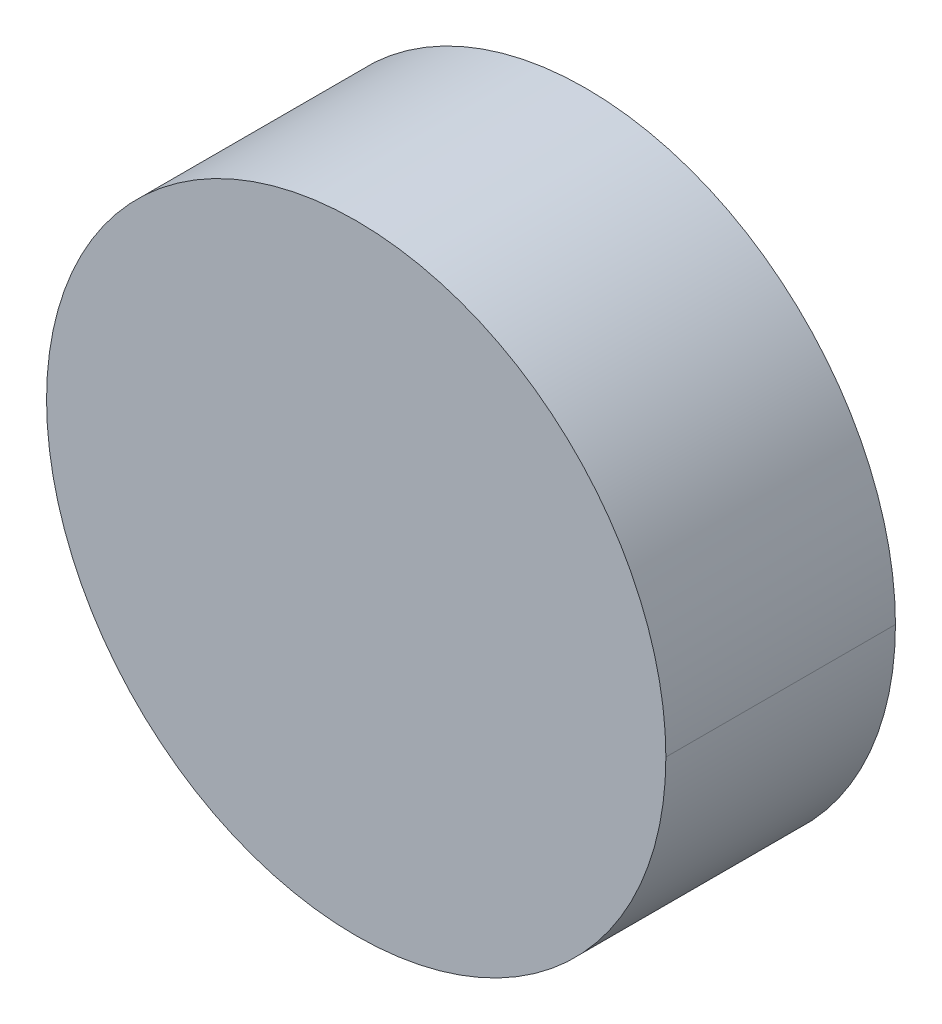
ISO-10303-21;
HEADER;
FILE_DESCRIPTION(('STEP AP214'),'2;1');
FILE_NAME('part.step','',(''),(''),'','','');
FILE_SCHEMA(('AUTOMOTIVE_DESIGN { 1 0 10303 214 1 1 1 1 }'));
ENDSEC;
DATA;
#1=APPLICATION_CONTEXT('core data for automotive mechanical design processes');
#2=APPLICATION_PROTOCOL_DEFINITION('international standard','automotive_design',2000,#1);
#3=PRODUCT_CONTEXT('',#1,'mechanical');
#4=PRODUCT('Part','Part','',(#3));
#5=PRODUCT_RELATED_PRODUCT_CATEGORY('part','',(#4));
#6=PRODUCT_DEFINITION_FORMATION('','',#4);
#7=PRODUCT_DEFINITION_CONTEXT('part definition',#1,'design');
#8=PRODUCT_DEFINITION('design','',#6,#7);
#9=PRODUCT_DEFINITION_SHAPE('','',#8);
#10=(LENGTH_UNIT() NAMED_UNIT(*) SI_UNIT(.MILLI.,.METRE.));
#11=(NAMED_UNIT(*) PLANE_ANGLE_UNIT() SI_UNIT($,.RADIAN.));
#12=(NAMED_UNIT(*) SI_UNIT($,.STERADIAN.) SOLID_ANGLE_UNIT());
#13=UNCERTAINTY_MEASURE_WITH_UNIT(LENGTH_MEASURE(1.E-05),#10,'distance_accuracy_value','');
#14=(GEOMETRIC_REPRESENTATION_CONTEXT(3) GLOBAL_UNCERTAINTY_ASSIGNED_CONTEXT((#13)) GLOBAL_UNIT_ASSIGNED_CONTEXT((#10,
#11,#12)) REPRESENTATION_CONTEXT('',''));
#15=CARTESIAN_POINT('',(0.,0.,0.));
#16=DIRECTION('',(0.,0.,1.));
#17=DIRECTION('',(1.,0.,0.));
#18=AXIS2_PLACEMENT_3D('',#15,#16,#17);
#19=CARTESIAN_POINT('',(0.,0.,21.5));
#20=DIRECTION('',(0.,0.,1.));
#21=DIRECTION('',(1.,0.,0.));
#22=AXIS2_PLACEMENT_3D('',#19,#20,#21);
#23=PLANE('',#22);
#24=CARTESIAN_POINT('',(0.,0.,21.5));
#25=DIRECTION('',(0.,0.,1.));
#26=DIRECTION('',(1.,0.,0.));
#27=AXIS2_PLACEMENT_3D('',#24,#25,#26);
#28=CIRCLE('',#27,29.);
#29=CARTESIAN_POINT('',(-29.,0.,21.5));
#30=VERTEX_POINT('',#29);
#31=CARTESIAN_POINT('',(29.,0.,21.5));
#32=VERTEX_POINT('',#31);
#33=EDGE_CURVE('E27',#30,#32,#28,.T.);
#34=ORIENTED_EDGE('',*,*,#33,.T.);
#35=CARTESIAN_POINT('',(0.,0.,21.5));
#36=DIRECTION('',(0.,0.,1.));
#37=DIRECTION('',(1.,0.,0.));
#38=AXIS2_PLACEMENT_3D('',#35,#36,#37);
#39=CIRCLE('',#38,29.);
#40=EDGE_CURVE('E65',#32,#30,#39,.T.);
#41=ORIENTED_EDGE('',*,*,#40,.T.);
#42=EDGE_LOOP('',(#34,#41));
#43=FACE_BOUND('',#42,.T.);
#44=ADVANCED_FACE('F16',(#43),#23,.T.);
#45=CARTESIAN_POINT('',(-29.348,-29.348,0.));
#46=DIRECTION('',(0.,0.,1.));
#47=DIRECTION('',(1.,0.,0.));
#48=AXIS2_PLACEMENT_3D('',#45,#46,#47);
#49=PLANE('',#48);
#50=CARTESIAN_POINT('',(0.,0.,0.));
#51=DIRECTION('',(0.,0.,-1.));
#52=DIRECTION('',(-1.,0.,0.));
#53=AXIS2_PLACEMENT_3D('',#50,#51,#52);
#54=CIRCLE('',#53,29.);
#55=CARTESIAN_POINT('',(-29.,0.,0.));
#56=VERTEX_POINT('',#55);
#57=CARTESIAN_POINT('',(29.,0.,0.));
#58=VERTEX_POINT('',#57);
#59=EDGE_CURVE('E20',#56,#58,#54,.T.);
#60=ORIENTED_EDGE('',*,*,#59,.T.);
#61=CARTESIAN_POINT('',(0.,0.,0.));
#62=DIRECTION('',(0.,0.,-1.));
#63=DIRECTION('',(-1.,0.,0.));
#64=AXIS2_PLACEMENT_3D('',#61,#62,#63);
#65=CIRCLE('',#64,29.);
#66=EDGE_CURVE('E11',#58,#56,#65,.T.);
#67=ORIENTED_EDGE('',*,*,#66,.T.);
#68=EDGE_LOOP('',(#60,#67));
#69=FACE_BOUND('',#68,.T.);
#70=ADVANCED_FACE('F18',(#69),#49,.F.);
#71=CARTESIAN_POINT('',(0.,0.,38.));
#72=DIRECTION('',(0.,0.,-1.));
#73=DIRECTION('',(-1.,0.,0.));
#74=AXIS2_PLACEMENT_3D('',#71,#72,#73);
#75=CYLINDRICAL_SURFACE('',#74,29.);
#76=DIRECTION('',(0.,0.,-1.));
#77=VECTOR('',#76,1.);
#78=CARTESIAN_POINT('',(29.,0.,38.));
#79=LINE('',#78,#77);
#80=EDGE_CURVE('E60',#32,#58,#79,.T.);
#81=ORIENTED_EDGE('',*,*,#80,.F.);
#82=ORIENTED_EDGE('',*,*,#33,.F.);
#83=DIRECTION('',(0.,0.,-1.));
#84=VECTOR('',#83,1.);
#85=CARTESIAN_POINT('',(-29.,0.,38.));
#86=LINE('',#85,#84);
#87=EDGE_CURVE('E57',#30,#56,#86,.T.);
#88=ORIENTED_EDGE('',*,*,#87,.T.);
#89=ORIENTED_EDGE('',*,*,#66,.F.);
#90=EDGE_LOOP('',(#81,#82,#88,#89));
#91=FACE_BOUND('',#90,.T.);
#92=ADVANCED_FACE('F56',(#91),#75,.T.);
#93=CARTESIAN_POINT('',(0.,0.,38.));
#94=DIRECTION('',(0.,0.,-1.));
#95=DIRECTION('',(-1.,0.,0.));
#96=AXIS2_PLACEMENT_3D('',#93,#94,#95);
#97=CYLINDRICAL_SURFACE('',#96,29.);
#98=ORIENTED_EDGE('',*,*,#40,.F.);
#99=ORIENTED_EDGE('',*,*,#80,.T.);
#100=ORIENTED_EDGE('',*,*,#59,.F.);
#101=ORIENTED_EDGE('',*,*,#87,.F.);
#102=EDGE_LOOP('',(#98,#99,#100,#101));
#103=FACE_BOUND('',#102,.T.);
#104=ADVANCED_FACE('F64',(#103),#97,.T.);
#105=CLOSED_SHELL('',(#44,#70,#92,#104));
#106=MANIFOLD_SOLID_BREP('B1',#105);
#107=ADVANCED_BREP_SHAPE_REPRESENTATION('',(#18,#106),#14);
#108=SHAPE_DEFINITION_REPRESENTATION(#9,#107);
ENDSEC;
END-ISO-10303-21;
